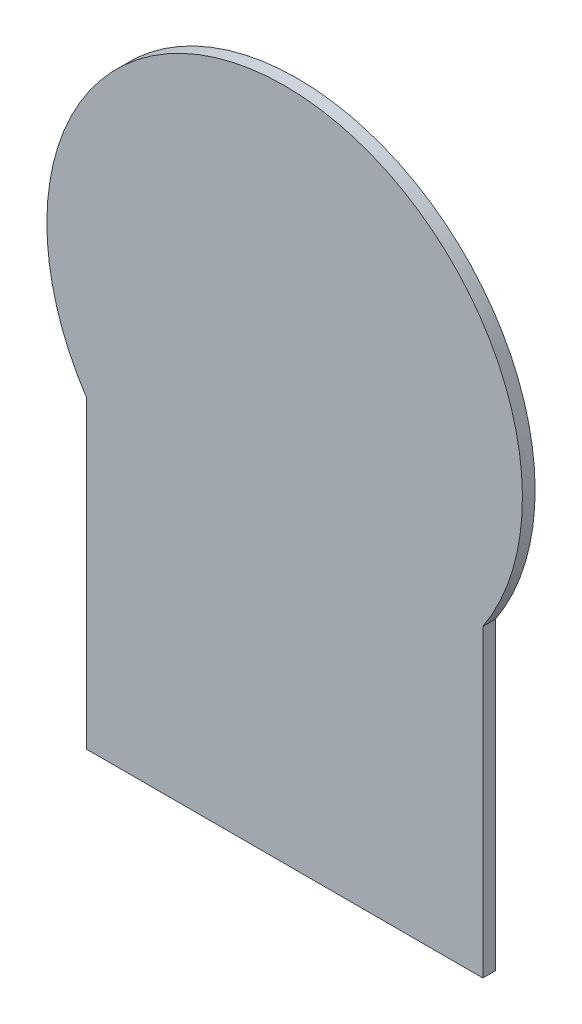
ISO-10303-21;
HEADER;
FILE_DESCRIPTION(('STEP AP214'),'2;1');
FILE_NAME('part.step','',(''),(''),'','','');
FILE_SCHEMA(('AUTOMOTIVE_DESIGN { 1 0 10303 214 1 1 1 1 }'));
ENDSEC;
DATA;
#1=APPLICATION_CONTEXT('core data for automotive mechanical design processes');
#2=APPLICATION_PROTOCOL_DEFINITION('international standard','automotive_design',2000,#1);
#3=PRODUCT_CONTEXT('',#1,'mechanical');
#4=PRODUCT('Part','Part','',(#3));
#5=PRODUCT_RELATED_PRODUCT_CATEGORY('part','',(#4));
#6=PRODUCT_DEFINITION_FORMATION('','',#4);
#7=PRODUCT_DEFINITION_CONTEXT('part definition',#1,'design');
#8=PRODUCT_DEFINITION('design','',#6,#7);
#9=PRODUCT_DEFINITION_SHAPE('','',#8);
#10=(LENGTH_UNIT() NAMED_UNIT(*) SI_UNIT(.MILLI.,.METRE.));
#11=(NAMED_UNIT(*) PLANE_ANGLE_UNIT() SI_UNIT($,.RADIAN.));
#12=(NAMED_UNIT(*) SI_UNIT($,.STERADIAN.) SOLID_ANGLE_UNIT());
#13=UNCERTAINTY_MEASURE_WITH_UNIT(LENGTH_MEASURE(1.E-05),#10,'distance_accuracy_value','');
#14=(GEOMETRIC_REPRESENTATION_CONTEXT(3) GLOBAL_UNCERTAINTY_ASSIGNED_CONTEXT((#13)) GLOBAL_UNIT_ASSIGNED_CONTEXT((#10,
#11,#12)) REPRESENTATION_CONTEXT('',''));
#15=CARTESIAN_POINT('',(0.,0.,0.));
#16=DIRECTION('',(0.,0.,1.));
#17=DIRECTION('',(1.,0.,0.));
#18=AXIS2_PLACEMENT_3D('',#15,#16,#17);
#19=CARTESIAN_POINT('',(0.,0.,0.2032));
#20=DIRECTION('',(0.,0.,-1.));
#21=DIRECTION('',(-1.,0.,0.));
#22=AXIS2_PLACEMENT_3D('',#19,#20,#21);
#23=CYLINDRICAL_SURFACE('',#22,3.81);
#24=CARTESIAN_POINT('',(0.,0.,0.));
#25=DIRECTION('',(0.,0.,1.));
#26=DIRECTION('',(1.,0.,0.));
#27=AXIS2_PLACEMENT_3D('',#24,#25,#26);
#28=CIRCLE('',#27,3.81);
#29=CARTESIAN_POINT('',(3.175,-2.10605674187568,0.));
#30=VERTEX_POINT('',#29);
#31=CARTESIAN_POINT('',(-3.175,-2.10605674187568,0.));
#32=VERTEX_POINT('',#31);
#33=EDGE_CURVE('E95',#30,#32,#28,.T.);
#34=ORIENTED_EDGE('',*,*,#33,.T.);
#35=DIRECTION('',(0.,0.,-1.));
#36=VECTOR('',#35,1.);
#37=CARTESIAN_POINT('',(-3.175,-2.10605674187568,0.2032));
#38=LINE('',#37,#36);
#39=CARTESIAN_POINT('',(-3.175,-2.10605674187568,0.2032));
#40=VERTEX_POINT('',#39);
#41=EDGE_CURVE('E11',#40,#32,#38,.T.);
#42=ORIENTED_EDGE('',*,*,#41,.F.);
#43=CARTESIAN_POINT('',(0.,0.,0.2032));
#44=DIRECTION('',(0.,0.,1.));
#45=DIRECTION('',(1.,0.,0.));
#46=AXIS2_PLACEMENT_3D('',#43,#44,#45);
#47=CIRCLE('',#46,3.81);
#48=CARTESIAN_POINT('',(3.175,-2.10605674187568,0.2032));
#49=VERTEX_POINT('',#48);
#50=EDGE_CURVE('E83',#49,#40,#47,.T.);
#51=ORIENTED_EDGE('',*,*,#50,.F.);
#52=DIRECTION('',(0.,0.,-1.));
#53=VECTOR('',#52,1.);
#54=CARTESIAN_POINT('',(3.175,-2.10605674187568,0.2032));
#55=LINE('',#54,#53);
#56=EDGE_CURVE('E91',#49,#30,#55,.T.);
#57=ORIENTED_EDGE('',*,*,#56,.T.);
#58=EDGE_LOOP('',(#34,#42,#51,#57));
#59=FACE_BOUND('',#58,.T.);
#60=ADVANCED_FACE('F32',(#59),#23,.T.);
#61=CARTESIAN_POINT('',(-3.175,-2.10605674187568,0.2032));
#62=DIRECTION('',(1.,0.,0.));
#63=DIRECTION('',(0.,1.,0.));
#64=AXIS2_PLACEMENT_3D('',#61,#62,#63);
#65=PLANE('',#64);
#66=DIRECTION('',(0.,-1.,0.));
#67=VECTOR('',#66,1.);
#68=CARTESIAN_POINT('',(-3.175,-2.10605674187568,0.));
#69=LINE('',#68,#67);
#70=CARTESIAN_POINT('',(-3.175,-6.985,0.));
#71=VERTEX_POINT('',#70);
#72=EDGE_CURVE('E87',#32,#71,#69,.T.);
#73=ORIENTED_EDGE('',*,*,#72,.T.);
#74=DIRECTION('',(0.,0.,-1.));
#75=VECTOR('',#74,1.);
#76=CARTESIAN_POINT('',(-3.175,-6.985,0.2032));
#77=LINE('',#76,#75);
#78=CARTESIAN_POINT('',(-3.175,-6.985,0.2032));
#79=VERTEX_POINT('',#78);
#80=EDGE_CURVE('E40',#79,#71,#77,.T.);
#81=ORIENTED_EDGE('',*,*,#80,.F.);
#82=DIRECTION('',(0.,-1.,0.));
#83=VECTOR('',#82,1.);
#84=CARTESIAN_POINT('',(-3.175,-2.10605674187568,0.2032));
#85=LINE('',#84,#83);
#86=EDGE_CURVE('E78',#40,#79,#85,.T.);
#87=ORIENTED_EDGE('',*,*,#86,.F.);
#88=ORIENTED_EDGE('',*,*,#41,.T.);
#89=EDGE_LOOP('',(#73,#81,#87,#88));
#90=FACE_BOUND('',#89,.T.);
#91=ADVANCED_FACE('F86',(#90),#65,.F.);
#92=CARTESIAN_POINT('',(-3.175,-6.985,0.2032));
#93=DIRECTION('',(0.,1.,0.));
#94=DIRECTION('',(0.,0.,1.));
#95=AXIS2_PLACEMENT_3D('',#92,#93,#94);
#96=PLANE('',#95);
#97=DIRECTION('',(1.,0.,0.));
#98=VECTOR('',#97,1.);
#99=CARTESIAN_POINT('',(-3.175,-6.985,0.));
#100=LINE('',#99,#98);
#101=CARTESIAN_POINT('',(3.175,-6.985,0.));
#102=VERTEX_POINT('',#101);
#103=EDGE_CURVE('E65',#71,#102,#100,.T.);
#104=ORIENTED_EDGE('',*,*,#103,.T.);
#105=DIRECTION('',(0.,0.,-1.));
#106=VECTOR('',#105,1.);
#107=CARTESIAN_POINT('',(3.175,-6.985,0.2032));
#108=LINE('',#107,#106);
#109=CARTESIAN_POINT('',(3.175,-6.985,0.2032));
#110=VERTEX_POINT('',#109);
#111=EDGE_CURVE('E88',#110,#102,#108,.T.);
#112=ORIENTED_EDGE('',*,*,#111,.F.);
#113=DIRECTION('',(1.,0.,0.));
#114=VECTOR('',#113,1.);
#115=CARTESIAN_POINT('',(-3.175,-6.985,0.2032));
#116=LINE('',#115,#114);
#117=EDGE_CURVE('E81',#79,#110,#116,.T.);
#118=ORIENTED_EDGE('',*,*,#117,.F.);
#119=ORIENTED_EDGE('',*,*,#80,.T.);
#120=EDGE_LOOP('',(#104,#112,#118,#119));
#121=FACE_BOUND('',#120,.T.);
#122=ADVANCED_FACE('F89',(#121),#96,.F.);
#123=CARTESIAN_POINT('',(3.175,-2.10605674187568,0.2032));
#124=DIRECTION('',(-1.,0.,0.));
#125=DIRECTION('',(0.,-1.,0.));
#126=AXIS2_PLACEMENT_3D('',#123,#124,#125);
#127=PLANE('',#126);
#128=DIRECTION('',(0.,1.,0.));
#129=VECTOR('',#128,1.);
#130=CARTESIAN_POINT('',(3.175,-2.10605674187568,0.));
#131=LINE('',#130,#129);
#132=EDGE_CURVE('E71',#102,#30,#131,.T.);
#133=ORIENTED_EDGE('',*,*,#132,.T.);
#134=ORIENTED_EDGE('',*,*,#56,.F.);
#135=DIRECTION('',(0.,1.,0.));
#136=VECTOR('',#135,1.);
#137=CARTESIAN_POINT('',(3.175,-2.10605674187568,0.2032));
#138=LINE('',#137,#136);
#139=EDGE_CURVE('E48',#110,#49,#138,.T.);
#140=ORIENTED_EDGE('',*,*,#139,.F.);
#141=ORIENTED_EDGE('',*,*,#111,.T.);
#142=EDGE_LOOP('',(#133,#134,#140,#141));
#143=FACE_BOUND('',#142,.T.);
#144=ADVANCED_FACE('F102',(#143),#127,.F.);
#145=CARTESIAN_POINT('',(0.,0.,0.2032));
#146=DIRECTION('',(0.,0.,1.));
#147=DIRECTION('',(1.,0.,0.));
#148=AXIS2_PLACEMENT_3D('',#145,#146,#147);
#149=PLANE('',#148);
#150=ORIENTED_EDGE('',*,*,#50,.T.);
#151=ORIENTED_EDGE('',*,*,#86,.T.);
#152=ORIENTED_EDGE('',*,*,#117,.T.);
#153=ORIENTED_EDGE('',*,*,#139,.T.);
#154=EDGE_LOOP('',(#150,#151,#152,#153));
#155=FACE_BOUND('',#154,.T.);
#156=ADVANCED_FACE('F79',(#155),#149,.T.);
#157=CARTESIAN_POINT('',(0.,0.,0.));
#158=DIRECTION('',(0.,0.,1.));
#159=DIRECTION('',(1.,0.,0.));
#160=AXIS2_PLACEMENT_3D('',#157,#158,#159);
#161=PLANE('',#160);
#162=ORIENTED_EDGE('',*,*,#33,.F.);
#163=ORIENTED_EDGE('',*,*,#132,.F.);
#164=ORIENTED_EDGE('',*,*,#103,.F.);
#165=ORIENTED_EDGE('',*,*,#72,.F.);
#166=EDGE_LOOP('',(#162,#163,#164,#165));
#167=FACE_BOUND('',#166,.T.);
#168=ADVANCED_FACE('F105',(#167),#161,.F.);
#169=CLOSED_SHELL('',(#60,#91,#122,#144,#156,#168));
#170=MANIFOLD_SOLID_BREP('B2',#169);
#171=ADVANCED_BREP_SHAPE_REPRESENTATION('',(#18,#170),#14);
#172=SHAPE_DEFINITION_REPRESENTATION(#9,#171);
ENDSEC;
END-ISO-10303-21;
